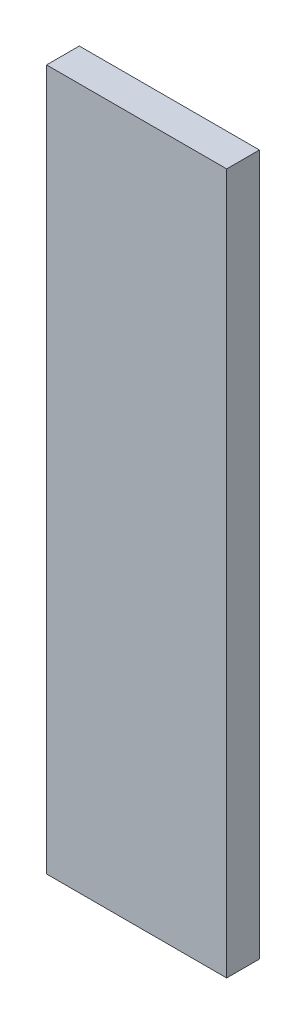
ISO-10303-21;
HEADER;
FILE_DESCRIPTION(('STEP AP214'),'2;1');
FILE_NAME('part.step','',(''),(''),'','','');
FILE_SCHEMA(('AUTOMOTIVE_DESIGN { 1 0 10303 214 1 1 1 1 }'));
ENDSEC;
DATA;
#1=APPLICATION_CONTEXT('core data for automotive mechanical design processes');
#2=APPLICATION_PROTOCOL_DEFINITION('international standard','automotive_design',2000,#1);
#3=PRODUCT_CONTEXT('',#1,'mechanical');
#4=PRODUCT('Part','Part','',(#3));
#5=PRODUCT_RELATED_PRODUCT_CATEGORY('part','',(#4));
#6=PRODUCT_DEFINITION_FORMATION('','',#4);
#7=PRODUCT_DEFINITION_CONTEXT('part definition',#1,'design');
#8=PRODUCT_DEFINITION('design','',#6,#7);
#9=PRODUCT_DEFINITION_SHAPE('','',#8);
#10=(LENGTH_UNIT() NAMED_UNIT(*) SI_UNIT(.MILLI.,.METRE.));
#11=(NAMED_UNIT(*) PLANE_ANGLE_UNIT() SI_UNIT($,.RADIAN.));
#12=(NAMED_UNIT(*) SI_UNIT($,.STERADIAN.) SOLID_ANGLE_UNIT());
#13=UNCERTAINTY_MEASURE_WITH_UNIT(LENGTH_MEASURE(1.E-05),#10,'distance_accuracy_value','');
#14=(GEOMETRIC_REPRESENTATION_CONTEXT(3) GLOBAL_UNCERTAINTY_ASSIGNED_CONTEXT((#13)) GLOBAL_UNIT_ASSIGNED_CONTEXT((#10,
#11,#12)) REPRESENTATION_CONTEXT('',''));
#15=CARTESIAN_POINT('',(0.,0.,0.));
#16=DIRECTION('',(0.,0.,1.));
#17=DIRECTION('',(1.,0.,0.));
#18=AXIS2_PLACEMENT_3D('',#15,#16,#17);
#19=CARTESIAN_POINT('',(-19.5,2.,-77.5));
#20=DIRECTION('',(0.,0.,1.));
#21=DIRECTION('',(1.,0.,0.));
#22=AXIS2_PLACEMENT_3D('',#19,#20,#21);
#23=PLANE('',#22);
#24=DIRECTION('',(0.,1.,0.));
#25=VECTOR('',#24,1.);
#26=CARTESIAN_POINT('',(-5.5,0.,-77.5));
#27=LINE('',#26,#25);
#28=CARTESIAN_POINT('',(-5.5,9.,-77.5));
#29=VERTEX_POINT('',#28);
#30=CARTESIAN_POINT('',(-5.5,51.8,-77.5));
#31=VERTEX_POINT('',#30);
#32=EDGE_CURVE('E57',#29,#31,#27,.T.);
#33=ORIENTED_EDGE('',*,*,#32,.T.);
#34=DIRECTION('',(1.,0.,0.));
#35=VECTOR('',#34,1.);
#36=CARTESIAN_POINT('',(-5.5,51.8,-77.5));
#37=LINE('',#36,#35);
#38=CARTESIAN_POINT('',(5.5,51.8,-77.5));
#39=VERTEX_POINT('',#38);
#40=EDGE_CURVE('E50',#31,#39,#37,.T.);
#41=ORIENTED_EDGE('',*,*,#40,.T.);
#42=DIRECTION('',(0.,1.,0.));
#43=VECTOR('',#42,1.);
#44=CARTESIAN_POINT('',(5.5,0.,-77.5));
#45=LINE('',#44,#43);
#46=CARTESIAN_POINT('',(5.5,9.,-77.5));
#47=VERTEX_POINT('',#46);
#48=EDGE_CURVE('E79',#47,#39,#45,.T.);
#49=ORIENTED_EDGE('',*,*,#48,.F.);
#50=DIRECTION('',(1.,0.,0.));
#51=VECTOR('',#50,1.);
#52=CARTESIAN_POINT('',(0.,9.,-77.5));
#53=LINE('',#52,#51);
#54=EDGE_CURVE('E101',#29,#47,#53,.T.);
#55=ORIENTED_EDGE('',*,*,#54,.F.);
#56=EDGE_LOOP('',(#33,#41,#49,#55));
#57=FACE_BOUND('',#56,.T.);
#58=ADVANCED_FACE('F36',(#57),#23,.F.);
#59=CARTESIAN_POINT('',(0.,60.,-75.5));
#60=DIRECTION('',(0.,0.,-1.));
#61=DIRECTION('',(-1.,0.,0.));
#62=AXIS2_PLACEMENT_3D('',#59,#60,#61);
#63=PLANE('',#62);
#64=DIRECTION('',(-1.,0.,0.));
#65=VECTOR('',#64,1.);
#66=CARTESIAN_POINT('',(21.9721359549996,51.8,-75.5));
#67=LINE('',#66,#65);
#68=CARTESIAN_POINT('',(5.5,51.8,-75.5));
#69=VERTEX_POINT('',#68);
#70=CARTESIAN_POINT('',(-5.5,51.8,-75.5));
#71=VERTEX_POINT('',#70);
#72=EDGE_CURVE('E11',#69,#71,#67,.T.);
#73=ORIENTED_EDGE('',*,*,#72,.T.);
#74=DIRECTION('',(0.,-1.,0.));
#75=VECTOR('',#74,1.);
#76=CARTESIAN_POINT('',(-5.5,60.,-75.5));
#77=LINE('',#76,#75);
#78=CARTESIAN_POINT('',(-5.5,9.,-75.5));
#79=VERTEX_POINT('',#78);
#80=EDGE_CURVE('E98',#71,#79,#77,.T.);
#81=ORIENTED_EDGE('',*,*,#80,.T.);
#82=DIRECTION('',(-1.,0.,0.));
#83=VECTOR('',#82,1.);
#84=CARTESIAN_POINT('',(-18.25,9.,-75.5));
#85=LINE('',#84,#83);
#86=CARTESIAN_POINT('',(5.5,9.,-75.5));
#87=VERTEX_POINT('',#86);
#88=EDGE_CURVE('E43',#87,#79,#85,.T.);
#89=ORIENTED_EDGE('',*,*,#88,.F.);
#90=DIRECTION('',(0.,-1.,0.));
#91=VECTOR('',#90,1.);
#92=CARTESIAN_POINT('',(5.5,60.,-75.5));
#93=LINE('',#92,#91);
#94=EDGE_CURVE('E96',#69,#87,#93,.T.);
#95=ORIENTED_EDGE('',*,*,#94,.F.);
#96=EDGE_LOOP('',(#73,#81,#89,#95));
#97=FACE_BOUND('',#96,.T.);
#98=ADVANCED_FACE('F107',(#97),#63,.F.);
#99=CARTESIAN_POINT('',(0.,9.,-77.5));
#100=DIRECTION('',(0.,-1.,0.));
#101=DIRECTION('',(0.,0.,-1.));
#102=AXIS2_PLACEMENT_3D('',#99,#100,#101);
#103=PLANE('',#102);
#104=DIRECTION('',(0.,0.,1.));
#105=VECTOR('',#104,1.);
#106=CARTESIAN_POINT('',(-5.5,9.,-77.5));
#107=LINE('',#106,#105);
#108=EDGE_CURVE('E93',#29,#79,#107,.T.);
#109=ORIENTED_EDGE('',*,*,#108,.F.);
#110=ORIENTED_EDGE('',*,*,#54,.T.);
#111=DIRECTION('',(0.,0.,1.));
#112=VECTOR('',#111,1.);
#113=CARTESIAN_POINT('',(5.5,9.,-77.5));
#114=LINE('',#113,#112);
#115=EDGE_CURVE('E89',#47,#87,#114,.T.);
#116=ORIENTED_EDGE('',*,*,#115,.T.);
#117=ORIENTED_EDGE('',*,*,#88,.T.);
#118=EDGE_LOOP('',(#109,#110,#116,#117));
#119=FACE_BOUND('',#118,.T.);
#120=ADVANCED_FACE('F105',(#119),#103,.T.);
#121=CARTESIAN_POINT('',(5.5,0.,-77.5));
#122=DIRECTION('',(1.,0.,0.));
#123=DIRECTION('',(0.,0.,-1.));
#124=AXIS2_PLACEMENT_3D('',#121,#122,#123);
#125=PLANE('',#124);
#126=DIRECTION('',(0.,0.,1.));
#127=VECTOR('',#126,1.);
#128=CARTESIAN_POINT('',(5.5,51.8,-77.5));
#129=LINE('',#128,#127);
#130=EDGE_CURVE('E74',#39,#69,#129,.T.);
#131=ORIENTED_EDGE('',*,*,#130,.T.);
#132=ORIENTED_EDGE('',*,*,#94,.T.);
#133=ORIENTED_EDGE('',*,*,#115,.F.);
#134=ORIENTED_EDGE('',*,*,#48,.T.);
#135=EDGE_LOOP('',(#131,#132,#133,#134));
#136=FACE_BOUND('',#135,.T.);
#137=ADVANCED_FACE('F87',(#136),#125,.T.);
#138=CARTESIAN_POINT('',(-5.5,0.,-77.5));
#139=DIRECTION('',(1.,0.,0.));
#140=DIRECTION('',(0.,0.,-1.));
#141=AXIS2_PLACEMENT_3D('',#138,#139,#140);
#142=PLANE('',#141);
#143=ORIENTED_EDGE('',*,*,#80,.F.);
#144=DIRECTION('',(0.,0.,1.));
#145=VECTOR('',#144,1.);
#146=CARTESIAN_POINT('',(-5.5,51.8,-77.5));
#147=LINE('',#146,#145);
#148=EDGE_CURVE('E80',#31,#71,#147,.T.);
#149=ORIENTED_EDGE('',*,*,#148,.F.);
#150=ORIENTED_EDGE('',*,*,#32,.F.);
#151=ORIENTED_EDGE('',*,*,#108,.T.);
#152=EDGE_LOOP('',(#143,#149,#150,#151));
#153=FACE_BOUND('',#152,.T.);
#154=ADVANCED_FACE('F109',(#153),#142,.F.);
#155=CARTESIAN_POINT('',(-5.5,51.8,-77.5));
#156=DIRECTION('',(0.,-1.,0.));
#157=DIRECTION('',(0.,0.,-1.));
#158=AXIS2_PLACEMENT_3D('',#155,#156,#157);
#159=PLANE('',#158);
#160=ORIENTED_EDGE('',*,*,#130,.F.);
#161=ORIENTED_EDGE('',*,*,#40,.F.);
#162=ORIENTED_EDGE('',*,*,#148,.T.);
#163=ORIENTED_EDGE('',*,*,#72,.F.);
#164=EDGE_LOOP('',(#160,#161,#162,#163));
#165=FACE_BOUND('',#164,.T.);
#166=ADVANCED_FACE('F75',(#165),#159,.F.);
#167=CLOSED_SHELL('',(#58,#98,#120,#137,#154,#166));
#168=MANIFOLD_SOLID_BREP('B2',#167);
#169=ADVANCED_BREP_SHAPE_REPRESENTATION('',(#18,#168),#14);
#170=SHAPE_DEFINITION_REPRESENTATION(#9,#169);
ENDSEC;
END-ISO-10303-21;
